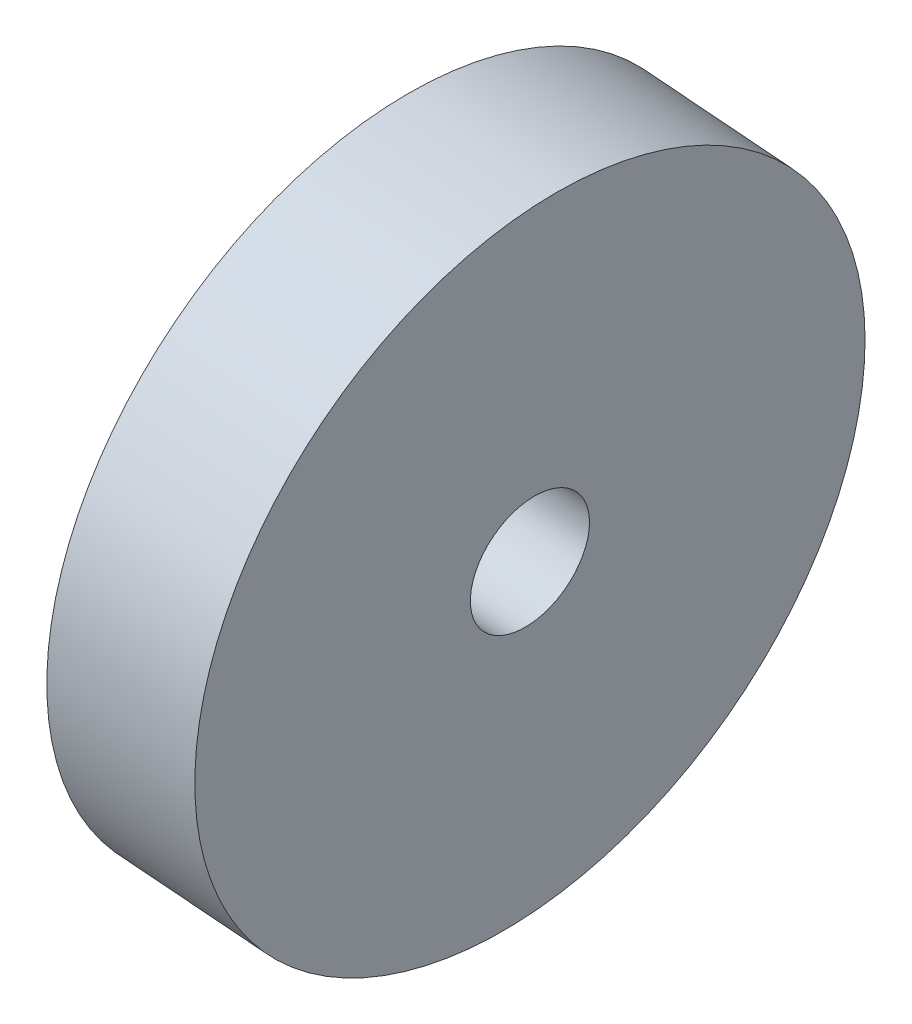
ISO-10303-21;
HEADER;
FILE_DESCRIPTION(('STEP AP214'),'2;1');
FILE_NAME('part.step','',(''),(''),'','','');
FILE_SCHEMA(('AUTOMOTIVE_DESIGN { 1 0 10303 214 1 1 1 1 }'));
ENDSEC;
DATA;
#1=APPLICATION_CONTEXT('core data for automotive mechanical design processes');
#2=APPLICATION_PROTOCOL_DEFINITION('international standard','automotive_design',2000,#1);
#3=PRODUCT_CONTEXT('',#1,'mechanical');
#4=PRODUCT('Part','Part','',(#3));
#5=PRODUCT_RELATED_PRODUCT_CATEGORY('part','',(#4));
#6=PRODUCT_DEFINITION_FORMATION('','',#4);
#7=PRODUCT_DEFINITION_CONTEXT('part definition',#1,'design');
#8=PRODUCT_DEFINITION('design','',#6,#7);
#9=PRODUCT_DEFINITION_SHAPE('','',#8);
#10=(LENGTH_UNIT() NAMED_UNIT(*) SI_UNIT(.MILLI.,.METRE.));
#11=(NAMED_UNIT(*) PLANE_ANGLE_UNIT() SI_UNIT($,.RADIAN.));
#12=(NAMED_UNIT(*) SI_UNIT($,.STERADIAN.) SOLID_ANGLE_UNIT());
#13=UNCERTAINTY_MEASURE_WITH_UNIT(LENGTH_MEASURE(1.E-05),#10,'distance_accuracy_value','');
#14=(GEOMETRIC_REPRESENTATION_CONTEXT(3) GLOBAL_UNCERTAINTY_ASSIGNED_CONTEXT((#13)) GLOBAL_UNIT_ASSIGNED_CONTEXT((#10,
#11,#12)) REPRESENTATION_CONTEXT('',''));
#15=CARTESIAN_POINT('',(0.,0.,0.));
#16=DIRECTION('',(0.,0.,1.));
#17=DIRECTION('',(1.,0.,0.));
#18=AXIS2_PLACEMENT_3D('',#15,#16,#17);
#19=CARTESIAN_POINT('',(228.628910451384,-9.66080811612064,43.174261814343));
#20=DIRECTION('',(0.996833274877087,-0.0795199477981641,0.));
#21=DIRECTION('',(0.0795199477981641,0.996833274877087,0.));
#22=AXIS2_PLACEMENT_3D('',#19,#20,#21);
#23=CYLINDRICAL_SURFACE('',#22,14.2875);
#24=CARTESIAN_POINT('',(228.628910451384,-9.66080811612064,43.174261814343));
#25=DIRECTION('',(0.996833274877087,-0.0795199477981641,0.));
#26=DIRECTION('',(0.0795199477981641,0.996833274877087,0.));
#27=AXIS2_PLACEMENT_3D('',#24,#25,#26);
#28=CIRCLE('',#27,14.2875);
#29=CARTESIAN_POINT('',(229.76505170555,4.58144729868575,43.174261814343));
#30=VERTEX_POINT('',#29);
#31=EDGE_CURVE('E10',#30,#30,#28,.T.);
#32=ORIENTED_EDGE('',*,*,#31,.T.);
#33=EDGE_LOOP('',(#32));
#34=FACE_BOUND('',#33,.T.);
#35=CARTESIAN_POINT('',(234.958801746853,-10.165759784639,43.174261814343));
#36=DIRECTION('',(0.996833274877087,-0.0795199477981641,0.));
#37=DIRECTION('',(0.0795199477981641,0.996833274877087,0.));
#38=AXIS2_PLACEMENT_3D('',#35,#36,#37);
#39=CIRCLE('',#38,14.2875);
#40=CARTESIAN_POINT('',(236.094943001019,4.0764956301674,43.174261814343));
#41=VERTEX_POINT('',#40);
#42=EDGE_CURVE('E33',#41,#41,#39,.T.);
#43=ORIENTED_EDGE('',*,*,#42,.F.);
#44=EDGE_LOOP('',(#43));
#45=FACE_BOUND('',#44,.T.);
#46=ADVANCED_FACE('F30',(#34,#45),#23,.T.);
#47=CARTESIAN_POINT('',(228.628910451384,-9.66080811612064,43.174261814343));
#48=DIRECTION('',(0.996833274877087,-0.0795199477981641,0.));
#49=DIRECTION('',(0.0795199477981641,0.996833274877087,0.));
#50=AXIS2_PLACEMENT_3D('',#47,#48,#49);
#51=PLANE('',#50);
#52=ORIENTED_EDGE('',*,*,#31,.F.);
#53=EDGE_LOOP('',(#52));
#54=FACE_BOUND('',#53,.T.);
#55=ADVANCED_FACE('F59',(#54),#51,.F.);
#56=CARTESIAN_POINT('',(234.958801746853,-10.165759784639,43.174261814343));
#57=DIRECTION('',(0.996833274877087,-0.0795199477981641,0.));
#58=DIRECTION('',(0.0795199477981641,0.996833274877087,0.));
#59=AXIS2_PLACEMENT_3D('',#56,#57,#58);
#60=PLANE('',#59);
#61=CARTESIAN_POINT('',(234.958801746853,-10.165759784639,43.174261814343));
#62=DIRECTION('',(0.996833274877087,-0.0795199477981641,0.));
#63=DIRECTION('',(0.0795199477981641,0.996833274877087,0.));
#64=AXIS2_PLACEMENT_3D('',#61,#62,#63);
#65=CIRCLE('',#64,2.54);
#66=CARTESIAN_POINT('',(235.16078241426,-7.63380326645118,43.174261814343));
#67=VERTEX_POINT('',#66);
#68=EDGE_CURVE('E42',#67,#67,#65,.T.);
#69=ORIENTED_EDGE('',*,*,#68,.F.);
#70=EDGE_LOOP('',(#69));
#71=FACE_BOUND('',#70,.T.);
#72=ORIENTED_EDGE('',*,*,#42,.T.);
#73=EDGE_LOOP('',(#72));
#74=FACE_BOUND('',#73,.T.);
#75=ADVANCED_FACE('F53',(#71,#74),#60,.T.);
#76=CARTESIAN_POINT('',(229.894888710477,-9.76179844982431,43.174261814343));
#77=DIRECTION('',(0.996833274877087,-0.0795199477981641,0.));
#78=DIRECTION('',(0.0795199477981641,0.996833274877087,0.));
#79=AXIS2_PLACEMENT_3D('',#76,#77,#78);
#80=CYLINDRICAL_SURFACE('',#79,2.54);
#81=CARTESIAN_POINT('',(229.894888710477,-9.76179844982431,43.174261814343));
#82=DIRECTION('',(0.996833274877087,-0.0795199477981641,0.));
#83=DIRECTION('',(0.0795199477981641,0.996833274877087,0.));
#84=AXIS2_PLACEMENT_3D('',#81,#82,#83);
#85=CIRCLE('',#84,2.54);
#86=CARTESIAN_POINT('',(230.096869377885,-7.22984193163651,43.174261814343));
#87=VERTEX_POINT('',#86);
#88=EDGE_CURVE('E40',#87,#87,#85,.T.);
#89=ORIENTED_EDGE('',*,*,#88,.F.);
#90=EDGE_LOOP('',(#89));
#91=FACE_BOUND('',#90,.T.);
#92=ORIENTED_EDGE('',*,*,#68,.T.);
#93=EDGE_LOOP('',(#92));
#94=FACE_BOUND('',#93,.T.);
#95=ADVANCED_FACE('F50',(#91,#94),#80,.F.);
#96=CARTESIAN_POINT('',(229.894888710477,-9.76179844982431,43.174261814343));
#97=DIRECTION('',(0.996833274877087,-0.0795199477981641,0.));
#98=DIRECTION('',(0.0795199477981641,0.996833274877087,0.));
#99=AXIS2_PLACEMENT_3D('',#96,#97,#98);
#100=PLANE('',#99);
#101=ORIENTED_EDGE('',*,*,#88,.T.);
#102=EDGE_LOOP('',(#101));
#103=FACE_BOUND('',#102,.T.);
#104=ADVANCED_FACE('F48',(#103),#100,.T.);
#105=CLOSED_SHELL('',(#46,#55,#75,#95,#104));
#106=MANIFOLD_SOLID_BREP('B2',#105);
#107=ADVANCED_BREP_SHAPE_REPRESENTATION('',(#18,#106),#14);
#108=SHAPE_DEFINITION_REPRESENTATION(#9,#107);
ENDSEC;
END-ISO-10303-21;
